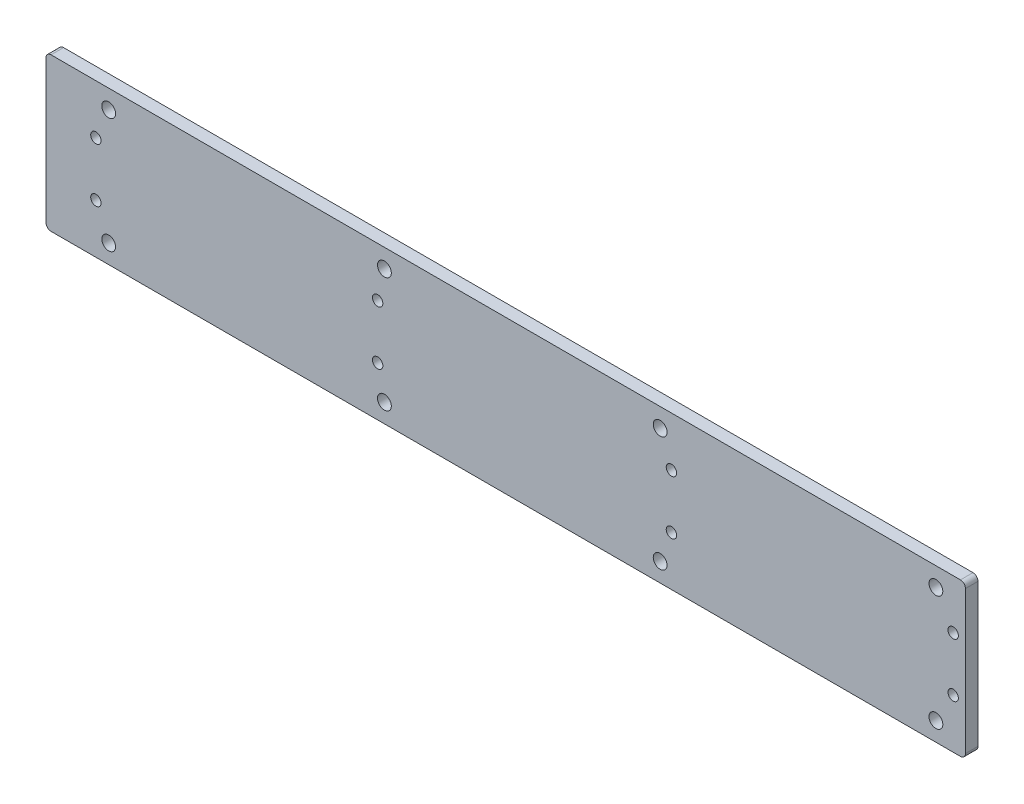
ISO-10303-21;
HEADER;
FILE_DESCRIPTION(('STEP AP214'),'2;1');
FILE_NAME('part.step','',(''),(''),'','','');
FILE_SCHEMA(('AUTOMOTIVE_DESIGN { 1 0 10303 214 1 1 1 1 }'));
ENDSEC;
DATA;
#1=APPLICATION_CONTEXT('core data for automotive mechanical design processes');
#2=APPLICATION_PROTOCOL_DEFINITION('international standard','automotive_design',2000,#1);
#3=PRODUCT_CONTEXT('',#1,'mechanical');
#4=PRODUCT('Part','Part','',(#3));
#5=PRODUCT_RELATED_PRODUCT_CATEGORY('part','',(#4));
#6=PRODUCT_DEFINITION_FORMATION('','',#4);
#7=PRODUCT_DEFINITION_CONTEXT('part definition',#1,'design');
#8=PRODUCT_DEFINITION('design','',#6,#7);
#9=PRODUCT_DEFINITION_SHAPE('','',#8);
#10=(LENGTH_UNIT() NAMED_UNIT(*) SI_UNIT(.MILLI.,.METRE.));
#11=(NAMED_UNIT(*) PLANE_ANGLE_UNIT() SI_UNIT($,.RADIAN.));
#12=(NAMED_UNIT(*) SI_UNIT($,.STERADIAN.) SOLID_ANGLE_UNIT());
#13=UNCERTAINTY_MEASURE_WITH_UNIT(LENGTH_MEASURE(1.E-05),#10,'distance_accuracy_value','');
#14=(GEOMETRIC_REPRESENTATION_CONTEXT(3) GLOBAL_UNCERTAINTY_ASSIGNED_CONTEXT((#13)) GLOBAL_UNIT_ASSIGNED_CONTEXT((#10,
#11,#12)) REPRESENTATION_CONTEXT('',''));
#15=CARTESIAN_POINT('',(0.,0.,0.));
#16=DIRECTION('',(0.,0.,1.));
#17=DIRECTION('',(1.,0.,0.));
#18=AXIS2_PLACEMENT_3D('',#15,#16,#17);
#19=CARTESIAN_POINT('',(-242.443,38.735,6.35));
#20=DIRECTION('',(0.,-1.,0.));
#21=DIRECTION('',(0.,0.,-1.));
#22=AXIS2_PLACEMENT_3D('',#19,#20,#21);
#23=PLANE('',#22);
#24=DIRECTION('',(-1.,0.,0.));
#25=VECTOR('',#24,1.);
#26=CARTESIAN_POINT('',(-242.443,38.735,6.35));
#27=LINE('',#26,#25);
#28=CARTESIAN_POINT('',(220.853,38.735,6.35));
#29=VERTEX_POINT('',#28);
#30=CARTESIAN_POINT('',(-239.903,38.735,6.35));
#31=VERTEX_POINT('',#30);
#32=EDGE_CURVE('E137',#29,#31,#27,.T.);
#33=ORIENTED_EDGE('',*,*,#32,.F.);
#34=DIRECTION('',(0.,0.,-1.));
#35=VECTOR('',#34,1.);
#36=CARTESIAN_POINT('',(220.853,38.735,6.35));
#37=LINE('',#36,#35);
#38=CARTESIAN_POINT('',(220.853,38.735,0.));
#39=VERTEX_POINT('',#38);
#40=EDGE_CURVE('E172',#29,#39,#37,.T.);
#41=ORIENTED_EDGE('',*,*,#40,.T.);
#42=DIRECTION('',(-1.,0.,0.));
#43=VECTOR('',#42,1.);
#44=CARTESIAN_POINT('',(-242.443,38.735,0.));
#45=LINE('',#44,#43);
#46=CARTESIAN_POINT('',(-239.903,38.735,0.));
#47=VERTEX_POINT('',#46);
#48=EDGE_CURVE('E184',#39,#47,#45,.T.);
#49=ORIENTED_EDGE('',*,*,#48,.T.);
#50=DIRECTION('',(0.,0.,-1.));
#51=VECTOR('',#50,1.);
#52=CARTESIAN_POINT('',(-239.903,38.735,6.35));
#53=LINE('',#52,#51);
#54=EDGE_CURVE('E169',#47,#31,#53,.F.);
#55=ORIENTED_EDGE('',*,*,#54,.T.);
#56=EDGE_LOOP('',(#33,#41,#49,#55));
#57=FACE_BOUND('',#56,.T.);
#58=ADVANCED_FACE('F38',(#57),#23,.F.);
#59=CARTESIAN_POINT('',(-242.443,-38.735,6.35));
#60=DIRECTION('',(1.,0.,0.));
#61=DIRECTION('',(0.,0.,-1.));
#62=AXIS2_PLACEMENT_3D('',#59,#60,#61);
#63=PLANE('',#62);
#64=DIRECTION('',(0.,-1.,0.));
#65=VECTOR('',#64,1.);
#66=CARTESIAN_POINT('',(-242.443,-38.735,0.));
#67=LINE('',#66,#65);
#68=CARTESIAN_POINT('',(-242.443,36.195,0.));
#69=VERTEX_POINT('',#68);
#70=CARTESIAN_POINT('',(-242.443,-36.195,0.));
#71=VERTEX_POINT('',#70);
#72=EDGE_CURVE('E139',#69,#71,#67,.T.);
#73=ORIENTED_EDGE('',*,*,#72,.T.);
#74=DIRECTION('',(0.,0.,-1.));
#75=VECTOR('',#74,1.);
#76=CARTESIAN_POINT('',(-242.443,-36.195,6.35));
#77=LINE('',#76,#75);
#78=CARTESIAN_POINT('',(-242.443,-36.195,6.35));
#79=VERTEX_POINT('',#78);
#80=EDGE_CURVE('E11',#71,#79,#77,.F.);
#81=ORIENTED_EDGE('',*,*,#80,.T.);
#82=DIRECTION('',(0.,-1.,0.));
#83=VECTOR('',#82,1.);
#84=CARTESIAN_POINT('',(-242.443,-38.735,6.35));
#85=LINE('',#84,#83);
#86=CARTESIAN_POINT('',(-242.443,36.195,6.35));
#87=VERTEX_POINT('',#86);
#88=EDGE_CURVE('E180',#87,#79,#85,.T.);
#89=ORIENTED_EDGE('',*,*,#88,.F.);
#90=DIRECTION('',(0.,0.,-1.));
#91=VECTOR('',#90,1.);
#92=CARTESIAN_POINT('',(-242.443,36.195,6.35));
#93=LINE('',#92,#91);
#94=EDGE_CURVE('E47',#87,#69,#93,.T.);
#95=ORIENTED_EDGE('',*,*,#94,.T.);
#96=EDGE_LOOP('',(#73,#81,#89,#95));
#97=FACE_BOUND('',#96,.T.);
#98=ADVANCED_FACE('F179',(#97),#63,.F.);
#99=CARTESIAN_POINT('',(-242.443,-38.735,6.35));
#100=DIRECTION('',(0.,1.,0.));
#101=DIRECTION('',(0.,0.,1.));
#102=AXIS2_PLACEMENT_3D('',#99,#100,#101);
#103=PLANE('',#102);
#104=DIRECTION('',(1.,0.,0.));
#105=VECTOR('',#104,1.);
#106=CARTESIAN_POINT('',(-242.443,-38.735,0.));
#107=LINE('',#106,#105);
#108=CARTESIAN_POINT('',(-239.903,-38.735,0.));
#109=VERTEX_POINT('',#108);
#110=CARTESIAN_POINT('',(220.853,-38.735,0.));
#111=VERTEX_POINT('',#110);
#112=EDGE_CURVE('E133',#109,#111,#107,.T.);
#113=ORIENTED_EDGE('',*,*,#112,.T.);
#114=DIRECTION('',(0.,0.,-1.));
#115=VECTOR('',#114,1.);
#116=CARTESIAN_POINT('',(220.853,-38.735,6.35));
#117=LINE('',#116,#115);
#118=CARTESIAN_POINT('',(220.853,-38.735,6.35));
#119=VERTEX_POINT('',#118);
#120=EDGE_CURVE('E109',#111,#119,#117,.F.);
#121=ORIENTED_EDGE('',*,*,#120,.T.);
#122=DIRECTION('',(1.,0.,0.));
#123=VECTOR('',#122,1.);
#124=CARTESIAN_POINT('',(-242.443,-38.735,6.35));
#125=LINE('',#124,#123);
#126=CARTESIAN_POINT('',(-239.903,-38.735,6.35));
#127=VERTEX_POINT('',#126);
#128=EDGE_CURVE('E144',#127,#119,#125,.T.);
#129=ORIENTED_EDGE('',*,*,#128,.F.);
#130=DIRECTION('',(0.,0.,-1.));
#131=VECTOR('',#130,1.);
#132=CARTESIAN_POINT('',(-239.903,-38.735,6.35));
#133=LINE('',#132,#131);
#134=EDGE_CURVE('E115',#127,#109,#133,.T.);
#135=ORIENTED_EDGE('',*,*,#134,.T.);
#136=EDGE_LOOP('',(#113,#121,#129,#135));
#137=FACE_BOUND('',#136,.T.);
#138=ADVANCED_FACE('F364',(#137),#103,.F.);
#139=CARTESIAN_POINT('',(223.393,-19.685,6.35));
#140=DIRECTION('',(-1.,0.,0.));
#141=DIRECTION('',(0.,0.,1.));
#142=AXIS2_PLACEMENT_3D('',#139,#140,#141);
#143=PLANE('',#142);
#144=DIRECTION('',(0.,1.,0.));
#145=VECTOR('',#144,1.);
#146=CARTESIAN_POINT('',(223.393,19.685,6.35));
#147=LINE('',#146,#145);
#148=CARTESIAN_POINT('',(223.393,-36.195,6.35));
#149=VERTEX_POINT('',#148);
#150=CARTESIAN_POINT('',(223.393,36.195,6.35));
#151=VERTEX_POINT('',#150);
#152=EDGE_CURVE('E125',#149,#151,#147,.T.);
#153=ORIENTED_EDGE('',*,*,#152,.F.);
#154=DIRECTION('',(0.,0.,-1.));
#155=VECTOR('',#154,1.);
#156=CARTESIAN_POINT('',(223.393,-36.195,6.35));
#157=LINE('',#156,#155);
#158=CARTESIAN_POINT('',(223.393,-36.195,0.));
#159=VERTEX_POINT('',#158);
#160=EDGE_CURVE('E108',#149,#159,#157,.T.);
#161=ORIENTED_EDGE('',*,*,#160,.T.);
#162=DIRECTION('',(0.,1.,0.));
#163=VECTOR('',#162,1.);
#164=CARTESIAN_POINT('',(223.393,-19.685,0.));
#165=LINE('',#164,#163);
#166=CARTESIAN_POINT('',(223.393,36.195,0.));
#167=VERTEX_POINT('',#166);
#168=EDGE_CURVE('E122',#159,#167,#165,.T.);
#169=ORIENTED_EDGE('',*,*,#168,.T.);
#170=DIRECTION('',(0.,0.,-1.));
#171=VECTOR('',#170,1.);
#172=CARTESIAN_POINT('',(223.393,36.195,6.35));
#173=LINE('',#172,#171);
#174=EDGE_CURVE('E128',#167,#151,#173,.F.);
#175=ORIENTED_EDGE('',*,*,#174,.T.);
#176=EDGE_LOOP('',(#153,#161,#169,#175));
#177=FACE_BOUND('',#176,.T.);
#178=ADVANCED_FACE('F121',(#177),#143,.F.);
#179=CARTESIAN_POINT('',(0.,0.,6.35));
#180=DIRECTION('',(0.,0.,-1.));
#181=DIRECTION('',(-1.,0.,0.));
#182=AXIS2_PLACEMENT_3D('',#179,#180,#181);
#183=PLANE('',#182);
#184=CARTESIAN_POINT('',(-70.9929999999999,29.21,6.35));
#185=DIRECTION('',(0.,0.,1.));
#186=DIRECTION('',(1.,0.,0.));
#187=AXIS2_PLACEMENT_3D('',#184,#185,#186);
#188=CIRCLE('',#187,3.5000057);
#189=CARTESIAN_POINT('',(-67.4929942999999,29.21,6.35));
#190=VERTEX_POINT('',#189);
#191=EDGE_CURVE('E293',#190,#190,#188,.T.);
#192=ORIENTED_EDGE('',*,*,#191,.F.);
#193=EDGE_LOOP('',(#192));
#194=FACE_BOUND('',#193,.T.);
#195=CARTESIAN_POINT('',(68.7070000000001,29.21,6.35));
#196=DIRECTION('',(0.,0.,1.));
#197=DIRECTION('',(1.,0.,0.));
#198=AXIS2_PLACEMENT_3D('',#195,#196,#197);
#199=CIRCLE('',#198,3.5000057);
#200=CARTESIAN_POINT('',(72.2070057000001,29.21,6.35));
#201=VERTEX_POINT('',#200);
#202=EDGE_CURVE('E285',#201,#201,#199,.T.);
#203=ORIENTED_EDGE('',*,*,#202,.F.);
#204=EDGE_LOOP('',(#203));
#205=FACE_BOUND('',#204,.T.);
#206=CARTESIAN_POINT('',(208.407,29.21,6.35));
#207=DIRECTION('',(0.,0.,1.));
#208=DIRECTION('',(1.,0.,0.));
#209=AXIS2_PLACEMENT_3D('',#206,#207,#208);
#210=CIRCLE('',#209,3.5000057);
#211=CARTESIAN_POINT('',(211.9070057,29.21,6.35));
#212=VERTEX_POINT('',#211);
#213=EDGE_CURVE('E277',#212,#212,#210,.T.);
#214=ORIENTED_EDGE('',*,*,#213,.F.);
#215=EDGE_LOOP('',(#214));
#216=FACE_BOUND('',#215,.T.);
#217=CARTESIAN_POINT('',(208.407,-29.21,6.35));
#218=DIRECTION('',(0.,0.,1.));
#219=DIRECTION('',(-1.,0.,0.));
#220=AXIS2_PLACEMENT_3D('',#217,#218,#219);
#221=CIRCLE('',#220,3.5000057);
#222=CARTESIAN_POINT('',(204.9069943,-29.21,6.35));
#223=VERTEX_POINT('',#222);
#224=EDGE_CURVE('E268',#223,#223,#221,.T.);
#225=ORIENTED_EDGE('',*,*,#224,.F.);
#226=EDGE_LOOP('',(#225));
#227=FACE_BOUND('',#226,.T.);
#228=CARTESIAN_POINT('',(68.7070000000001,-29.21,6.35));
#229=DIRECTION('',(0.,0.,1.));
#230=DIRECTION('',(-1.,0.,0.));
#231=AXIS2_PLACEMENT_3D('',#228,#229,#230);
#232=CIRCLE('',#231,3.5000057);
#233=CARTESIAN_POINT('',(65.2069943,-29.21,6.35));
#234=VERTEX_POINT('',#233);
#235=EDGE_CURVE('E316',#234,#234,#232,.T.);
#236=ORIENTED_EDGE('',*,*,#235,.F.);
#237=EDGE_LOOP('',(#236));
#238=FACE_BOUND('',#237,.T.);
#239=CARTESIAN_POINT('',(-70.9929999999999,-29.21,6.35));
#240=DIRECTION('',(0.,0.,1.));
#241=DIRECTION('',(-1.,0.,0.));
#242=AXIS2_PLACEMENT_3D('',#239,#240,#241);
#243=CIRCLE('',#242,3.5000057);
#244=CARTESIAN_POINT('',(-74.4930056999999,-29.21,6.35));
#245=VERTEX_POINT('',#244);
#246=EDGE_CURVE('E308',#245,#245,#243,.T.);
#247=ORIENTED_EDGE('',*,*,#246,.F.);
#248=EDGE_LOOP('',(#247));
#249=FACE_BOUND('',#248,.T.);
#250=CARTESIAN_POINT('',(-210.693,-29.21,6.35));
#251=DIRECTION('',(0.,0.,1.));
#252=DIRECTION('',(-1.,0.,0.));
#253=AXIS2_PLACEMENT_3D('',#250,#251,#252);
#254=CIRCLE('',#253,3.5000057);
#255=CARTESIAN_POINT('',(-214.1930057,-29.21,6.35));
#256=VERTEX_POINT('',#255);
#257=EDGE_CURVE('E300',#256,#256,#254,.T.);
#258=ORIENTED_EDGE('',*,*,#257,.F.);
#259=EDGE_LOOP('',(#258));
#260=FACE_BOUND('',#259,.T.);
#261=CARTESIAN_POINT('',(-210.693,29.21,6.35));
#262=DIRECTION('',(0.,0.,1.));
#263=DIRECTION('',(1.,0.,0.));
#264=AXIS2_PLACEMENT_3D('',#261,#262,#263);
#265=CIRCLE('',#264,3.5000057);
#266=CARTESIAN_POINT('',(-207.1929943,29.21,6.35));
#267=VERTEX_POINT('',#266);
#268=EDGE_CURVE('E260',#267,#267,#265,.T.);
#269=ORIENTED_EDGE('',*,*,#268,.F.);
#270=EDGE_LOOP('',(#269));
#271=FACE_BOUND('',#270,.T.);
#272=CARTESIAN_POINT('',(-217.17,-13.68025,6.35));
#273=DIRECTION('',(0.,0.,1.));
#274=DIRECTION('',(1.,0.,0.));
#275=AXIS2_PLACEMENT_3D('',#272,#273,#274);
#276=CIRCLE('',#275,2.63124999999999);
#277=CARTESIAN_POINT('',(-214.53875,-13.68025,6.35));
#278=VERTEX_POINT('',#277);
#279=EDGE_CURVE('E229',#278,#278,#276,.T.);
#280=ORIENTED_EDGE('',*,*,#279,.F.);
#281=EDGE_LOOP('',(#280));
#282=FACE_BOUND('',#281,.T.);
#283=CARTESIAN_POINT('',(217.17,-13.68025,6.35));
#284=DIRECTION('',(0.,0.,1.));
#285=DIRECTION('',(-1.,0.,0.));
#286=AXIS2_PLACEMENT_3D('',#283,#284,#285);
#287=CIRCLE('',#286,2.63124999999999);
#288=CARTESIAN_POINT('',(214.53875,-13.68025,6.35));
#289=VERTEX_POINT('',#288);
#290=EDGE_CURVE('E221',#289,#289,#287,.T.);
#291=ORIENTED_EDGE('',*,*,#290,.F.);
#292=EDGE_LOOP('',(#291));
#293=FACE_BOUND('',#292,.T.);
#294=CARTESIAN_POINT('',(217.17,13.68025,6.35));
#295=DIRECTION('',(0.,0.,1.));
#296=DIRECTION('',(-1.,0.,0.));
#297=AXIS2_PLACEMENT_3D('',#294,#295,#296);
#298=CIRCLE('',#297,2.63124999999999);
#299=CARTESIAN_POINT('',(214.53875,13.68025,6.35));
#300=VERTEX_POINT('',#299);
#301=EDGE_CURVE('E213',#300,#300,#298,.T.);
#302=ORIENTED_EDGE('',*,*,#301,.F.);
#303=EDGE_LOOP('',(#302));
#304=FACE_BOUND('',#303,.T.);
#305=CARTESIAN_POINT('',(-74.4219999999999,13.68025,6.35));
#306=DIRECTION('',(0.,0.,1.));
#307=DIRECTION('',(1.,0.,0.));
#308=AXIS2_PLACEMENT_3D('',#305,#306,#307);
#309=CIRCLE('',#308,2.63125);
#310=CARTESIAN_POINT('',(-71.7907499999999,13.68025,6.35));
#311=VERTEX_POINT('',#310);
#312=EDGE_CURVE('E204',#311,#311,#309,.T.);
#313=ORIENTED_EDGE('',*,*,#312,.F.);
#314=EDGE_LOOP('',(#313));
#315=FACE_BOUND('',#314,.T.);
#316=CARTESIAN_POINT('',(74.422,-13.68025,6.35));
#317=DIRECTION('',(0.,0.,1.));
#318=DIRECTION('',(-1.,0.,0.));
#319=AXIS2_PLACEMENT_3D('',#316,#317,#318);
#320=CIRCLE('',#319,2.63125);
#321=CARTESIAN_POINT('',(71.79075,-13.68025,6.35));
#322=VERTEX_POINT('',#321);
#323=EDGE_CURVE('E252',#322,#322,#320,.T.);
#324=ORIENTED_EDGE('',*,*,#323,.F.);
#325=EDGE_LOOP('',(#324));
#326=FACE_BOUND('',#325,.T.);
#327=CARTESIAN_POINT('',(74.422,13.68025,6.35));
#328=DIRECTION('',(0.,0.,1.));
#329=DIRECTION('',(1.,0.,0.));
#330=AXIS2_PLACEMENT_3D('',#327,#328,#329);
#331=CIRCLE('',#330,2.63125);
#332=CARTESIAN_POINT('',(77.05325,13.68025,6.35));
#333=VERTEX_POINT('',#332);
#334=EDGE_CURVE('E236',#333,#333,#331,.T.);
#335=ORIENTED_EDGE('',*,*,#334,.F.);
#336=EDGE_LOOP('',(#335));
#337=FACE_BOUND('',#336,.T.);
#338=CARTESIAN_POINT('',(-74.4219999999999,-13.68025,6.35));
#339=DIRECTION('',(0.,0.,1.));
#340=DIRECTION('',(-1.,0.,0.));
#341=AXIS2_PLACEMENT_3D('',#338,#339,#340);
#342=CIRCLE('',#341,2.63125);
#343=CARTESIAN_POINT('',(-77.0532499999999,-13.68025,6.35));
#344=VERTEX_POINT('',#343);
#345=EDGE_CURVE('E245',#344,#344,#342,.T.);
#346=ORIENTED_EDGE('',*,*,#345,.F.);
#347=EDGE_LOOP('',(#346));
#348=FACE_BOUND('',#347,.T.);
#349=CARTESIAN_POINT('',(-217.17,13.68025,6.35));
#350=DIRECTION('',(0.,0.,1.));
#351=DIRECTION('',(1.,0.,0.));
#352=AXIS2_PLACEMENT_3D('',#349,#350,#351);
#353=CIRCLE('',#352,2.63124999999999);
#354=CARTESIAN_POINT('',(-214.53875,13.68025,6.35));
#355=VERTEX_POINT('',#354);
#356=EDGE_CURVE('E196',#355,#355,#353,.T.);
#357=ORIENTED_EDGE('',*,*,#356,.F.);
#358=EDGE_LOOP('',(#357));
#359=FACE_BOUND('',#358,.T.);
#360=ORIENTED_EDGE('',*,*,#128,.T.);
#361=CARTESIAN_POINT('',(220.853,-36.195,6.35));
#362=DIRECTION('',(0.,0.,-1.));
#363=DIRECTION('',(-1.,0.,0.));
#364=AXIS2_PLACEMENT_3D('',#361,#362,#363);
#365=CIRCLE('',#364,2.54);
#366=EDGE_CURVE('E166',#119,#149,#365,.F.);
#367=ORIENTED_EDGE('',*,*,#366,.T.);
#368=ORIENTED_EDGE('',*,*,#152,.T.);
#369=CARTESIAN_POINT('',(220.853,36.195,6.35));
#370=DIRECTION('',(0.,0.,-1.));
#371=DIRECTION('',(-1.,0.,0.));
#372=AXIS2_PLACEMENT_3D('',#369,#370,#371);
#373=CIRCLE('',#372,2.54);
#374=EDGE_CURVE('E163',#151,#29,#373,.F.);
#375=ORIENTED_EDGE('',*,*,#374,.T.);
#376=ORIENTED_EDGE('',*,*,#32,.T.);
#377=CARTESIAN_POINT('',(-239.903,36.195,6.35));
#378=DIRECTION('',(0.,0.,-1.));
#379=DIRECTION('',(-1.,0.,0.));
#380=AXIS2_PLACEMENT_3D('',#377,#378,#379);
#381=CIRCLE('',#380,2.54);
#382=EDGE_CURVE('E59',#31,#87,#381,.F.);
#383=ORIENTED_EDGE('',*,*,#382,.T.);
#384=ORIENTED_EDGE('',*,*,#88,.T.);
#385=CARTESIAN_POINT('',(-239.903,-36.195,6.35));
#386=DIRECTION('',(0.,0.,-1.));
#387=DIRECTION('',(-1.,0.,0.));
#388=AXIS2_PLACEMENT_3D('',#385,#386,#387);
#389=CIRCLE('',#388,2.54);
#390=EDGE_CURVE('E160',#79,#127,#389,.F.);
#391=ORIENTED_EDGE('',*,*,#390,.T.);
#392=EDGE_LOOP('',(#360,#367,#368,#375,#376,#383,#384,#391));
#393=FACE_BOUND('',#392,.T.);
#394=ADVANCED_FACE('F334',(#194,#205,#216,#227,#238,#249,#260,#271,#282,#293,#304,#315,#326,
#337,#348,#359,#393),#183,.F.);
#395=CARTESIAN_POINT('',(0.,0.,0.));
#396=DIRECTION('',(0.,0.,-1.));
#397=DIRECTION('',(-1.,0.,0.));
#398=AXIS2_PLACEMENT_3D('',#395,#396,#397);
#399=PLANE('',#398);
#400=CARTESIAN_POINT('',(-70.9929999999999,29.21,0.));
#401=DIRECTION('',(0.,0.,1.));
#402=DIRECTION('',(1.,0.,0.));
#403=AXIS2_PLACEMENT_3D('',#400,#401,#402);
#404=CIRCLE('',#403,3.5000057);
#405=CARTESIAN_POINT('',(-67.4929942999999,29.21,0.));
#406=VERTEX_POINT('',#405);
#407=EDGE_CURVE('E264',#406,#406,#404,.T.);
#408=ORIENTED_EDGE('',*,*,#407,.T.);
#409=EDGE_LOOP('',(#408));
#410=FACE_BOUND('',#409,.T.);
#411=CARTESIAN_POINT('',(68.7070000000001,29.21,0.));
#412=DIRECTION('',(0.,0.,1.));
#413=DIRECTION('',(1.,0.,0.));
#414=AXIS2_PLACEMENT_3D('',#411,#412,#413);
#415=CIRCLE('',#414,3.5000057);
#416=CARTESIAN_POINT('',(72.2070057000001,29.21,0.));
#417=VERTEX_POINT('',#416);
#418=EDGE_CURVE('E289',#417,#417,#415,.T.);
#419=ORIENTED_EDGE('',*,*,#418,.T.);
#420=EDGE_LOOP('',(#419));
#421=FACE_BOUND('',#420,.T.);
#422=CARTESIAN_POINT('',(208.407,29.21,0.));
#423=DIRECTION('',(0.,0.,1.));
#424=DIRECTION('',(1.,0.,0.));
#425=AXIS2_PLACEMENT_3D('',#422,#423,#424);
#426=CIRCLE('',#425,3.5000057);
#427=CARTESIAN_POINT('',(211.9070057,29.21,0.));
#428=VERTEX_POINT('',#427);
#429=EDGE_CURVE('E281',#428,#428,#426,.T.);
#430=ORIENTED_EDGE('',*,*,#429,.T.);
#431=EDGE_LOOP('',(#430));
#432=FACE_BOUND('',#431,.T.);
#433=CARTESIAN_POINT('',(208.407,-29.21,0.));
#434=DIRECTION('',(0.,0.,1.));
#435=DIRECTION('',(-1.,0.,0.));
#436=AXIS2_PLACEMENT_3D('',#433,#434,#435);
#437=CIRCLE('',#436,3.5000057);
#438=CARTESIAN_POINT('',(204.9069943,-29.21,0.));
#439=VERTEX_POINT('',#438);
#440=EDGE_CURVE('E272',#439,#439,#437,.T.);
#441=ORIENTED_EDGE('',*,*,#440,.T.);
#442=EDGE_LOOP('',(#441));
#443=FACE_BOUND('',#442,.T.);
#444=CARTESIAN_POINT('',(68.7070000000001,-29.21,0.));
#445=DIRECTION('',(0.,0.,1.));
#446=DIRECTION('',(-1.,0.,0.));
#447=AXIS2_PLACEMENT_3D('',#444,#445,#446);
#448=CIRCLE('',#447,3.5000057);
#449=CARTESIAN_POINT('',(65.2069943,-29.21,0.));
#450=VERTEX_POINT('',#449);
#451=EDGE_CURVE('E273',#450,#450,#448,.T.);
#452=ORIENTED_EDGE('',*,*,#451,.T.);
#453=EDGE_LOOP('',(#452));
#454=FACE_BOUND('',#453,.T.);
#455=CARTESIAN_POINT('',(-70.9929999999999,-29.21,0.));
#456=DIRECTION('',(0.,0.,1.));
#457=DIRECTION('',(-1.,0.,0.));
#458=AXIS2_PLACEMENT_3D('',#455,#456,#457);
#459=CIRCLE('',#458,3.5000057);
#460=CARTESIAN_POINT('',(-74.4930056999999,-29.21,0.));
#461=VERTEX_POINT('',#460);
#462=EDGE_CURVE('E312',#461,#461,#459,.T.);
#463=ORIENTED_EDGE('',*,*,#462,.T.);
#464=EDGE_LOOP('',(#463));
#465=FACE_BOUND('',#464,.T.);
#466=CARTESIAN_POINT('',(-210.693,-29.21,0.));
#467=DIRECTION('',(0.,0.,1.));
#468=DIRECTION('',(-1.,0.,0.));
#469=AXIS2_PLACEMENT_3D('',#466,#467,#468);
#470=CIRCLE('',#469,3.5000057);
#471=CARTESIAN_POINT('',(-214.1930057,-29.21,0.));
#472=VERTEX_POINT('',#471);
#473=EDGE_CURVE('E304',#472,#472,#470,.T.);
#474=ORIENTED_EDGE('',*,*,#473,.T.);
#475=EDGE_LOOP('',(#474));
#476=FACE_BOUND('',#475,.T.);
#477=CARTESIAN_POINT('',(-210.693,29.21,0.));
#478=DIRECTION('',(0.,0.,1.));
#479=DIRECTION('',(1.,0.,0.));
#480=AXIS2_PLACEMENT_3D('',#477,#478,#479);
#481=CIRCLE('',#480,3.5000057);
#482=CARTESIAN_POINT('',(-207.1929943,29.21,0.));
#483=VERTEX_POINT('',#482);
#484=EDGE_CURVE('E256',#483,#483,#481,.T.);
#485=ORIENTED_EDGE('',*,*,#484,.T.);
#486=EDGE_LOOP('',(#485));
#487=FACE_BOUND('',#486,.T.);
#488=CARTESIAN_POINT('',(-217.17,-13.68025,0.));
#489=DIRECTION('',(0.,0.,1.));
#490=DIRECTION('',(1.,0.,0.));
#491=AXIS2_PLACEMENT_3D('',#488,#489,#490);
#492=CIRCLE('',#491,2.63124999999999);
#493=CARTESIAN_POINT('',(-214.53875,-13.68025,0.));
#494=VERTEX_POINT('',#493);
#495=EDGE_CURVE('E200',#494,#494,#492,.T.);
#496=ORIENTED_EDGE('',*,*,#495,.T.);
#497=EDGE_LOOP('',(#496));
#498=FACE_BOUND('',#497,.T.);
#499=CARTESIAN_POINT('',(217.17,-13.68025,0.));
#500=DIRECTION('',(0.,0.,1.));
#501=DIRECTION('',(-1.,0.,0.));
#502=AXIS2_PLACEMENT_3D('',#499,#500,#501);
#503=CIRCLE('',#502,2.63124999999999);
#504=CARTESIAN_POINT('',(214.53875,-13.68025,0.));
#505=VERTEX_POINT('',#504);
#506=EDGE_CURVE('E225',#505,#505,#503,.T.);
#507=ORIENTED_EDGE('',*,*,#506,.T.);
#508=EDGE_LOOP('',(#507));
#509=FACE_BOUND('',#508,.T.);
#510=CARTESIAN_POINT('',(217.17,13.68025,0.));
#511=DIRECTION('',(0.,0.,1.));
#512=DIRECTION('',(-1.,0.,0.));
#513=AXIS2_PLACEMENT_3D('',#510,#511,#512);
#514=CIRCLE('',#513,2.63124999999999);
#515=CARTESIAN_POINT('',(214.53875,13.68025,0.));
#516=VERTEX_POINT('',#515);
#517=EDGE_CURVE('E217',#516,#516,#514,.T.);
#518=ORIENTED_EDGE('',*,*,#517,.T.);
#519=EDGE_LOOP('',(#518));
#520=FACE_BOUND('',#519,.T.);
#521=CARTESIAN_POINT('',(-74.4219999999999,13.68025,0.));
#522=DIRECTION('',(0.,0.,1.));
#523=DIRECTION('',(1.,0.,0.));
#524=AXIS2_PLACEMENT_3D('',#521,#522,#523);
#525=CIRCLE('',#524,2.63125);
#526=CARTESIAN_POINT('',(-71.7907499999999,13.68025,0.));
#527=VERTEX_POINT('',#526);
#528=EDGE_CURVE('E208',#527,#527,#525,.T.);
#529=ORIENTED_EDGE('',*,*,#528,.T.);
#530=EDGE_LOOP('',(#529));
#531=FACE_BOUND('',#530,.T.);
#532=CARTESIAN_POINT('',(74.422,-13.68025,0.));
#533=DIRECTION('',(0.,0.,1.));
#534=DIRECTION('',(-1.,0.,0.));
#535=AXIS2_PLACEMENT_3D('',#532,#533,#534);
#536=CIRCLE('',#535,2.63125);
#537=CARTESIAN_POINT('',(71.79075,-13.68025,0.));
#538=VERTEX_POINT('',#537);
#539=EDGE_CURVE('E241',#538,#538,#536,.T.);
#540=ORIENTED_EDGE('',*,*,#539,.T.);
#541=EDGE_LOOP('',(#540));
#542=FACE_BOUND('',#541,.T.);
#543=CARTESIAN_POINT('',(74.422,13.68025,0.));
#544=DIRECTION('',(0.,0.,1.));
#545=DIRECTION('',(1.,0.,0.));
#546=AXIS2_PLACEMENT_3D('',#543,#544,#545);
#547=CIRCLE('',#546,2.63125);
#548=CARTESIAN_POINT('',(77.05325,13.68025,0.));
#549=VERTEX_POINT('',#548);
#550=EDGE_CURVE('E240',#549,#549,#547,.T.);
#551=ORIENTED_EDGE('',*,*,#550,.T.);
#552=EDGE_LOOP('',(#551));
#553=FACE_BOUND('',#552,.T.);
#554=CARTESIAN_POINT('',(-74.4219999999999,-13.68025,0.));
#555=DIRECTION('',(0.,0.,1.));
#556=DIRECTION('',(-1.,0.,0.));
#557=AXIS2_PLACEMENT_3D('',#554,#555,#556);
#558=CIRCLE('',#557,2.63125);
#559=CARTESIAN_POINT('',(-77.0532499999999,-13.68025,0.));
#560=VERTEX_POINT('',#559);
#561=EDGE_CURVE('E209',#560,#560,#558,.T.);
#562=ORIENTED_EDGE('',*,*,#561,.T.);
#563=EDGE_LOOP('',(#562));
#564=FACE_BOUND('',#563,.T.);
#565=CARTESIAN_POINT('',(-217.17,13.68025,0.));
#566=DIRECTION('',(0.,0.,1.));
#567=DIRECTION('',(1.,0.,0.));
#568=AXIS2_PLACEMENT_3D('',#565,#566,#567);
#569=CIRCLE('',#568,2.63124999999999);
#570=CARTESIAN_POINT('',(-214.53875,13.68025,0.));
#571=VERTEX_POINT('',#570);
#572=EDGE_CURVE('E186',#571,#571,#569,.T.);
#573=ORIENTED_EDGE('',*,*,#572,.T.);
#574=EDGE_LOOP('',(#573));
#575=FACE_BOUND('',#574,.T.);
#576=ORIENTED_EDGE('',*,*,#168,.F.);
#577=CARTESIAN_POINT('',(220.853,-36.195,0.));
#578=DIRECTION('',(0.,0.,-1.));
#579=DIRECTION('',(-1.,0.,0.));
#580=AXIS2_PLACEMENT_3D('',#577,#578,#579);
#581=CIRCLE('',#580,2.54);
#582=EDGE_CURVE('E104',#159,#111,#581,.T.);
#583=ORIENTED_EDGE('',*,*,#582,.T.);
#584=ORIENTED_EDGE('',*,*,#112,.F.);
#585=CARTESIAN_POINT('',(-239.903,-36.195,0.));
#586=DIRECTION('',(0.,0.,-1.));
#587=DIRECTION('',(-1.,0.,0.));
#588=AXIS2_PLACEMENT_3D('',#585,#586,#587);
#589=CIRCLE('',#588,2.54);
#590=EDGE_CURVE('E148',#109,#71,#589,.T.);
#591=ORIENTED_EDGE('',*,*,#590,.T.);
#592=ORIENTED_EDGE('',*,*,#72,.F.);
#593=CARTESIAN_POINT('',(-239.903,36.195,0.));
#594=DIRECTION('',(0.,0.,-1.));
#595=DIRECTION('',(-1.,0.,0.));
#596=AXIS2_PLACEMENT_3D('',#593,#594,#595);
#597=CIRCLE('',#596,2.54);
#598=EDGE_CURVE('E127',#69,#47,#597,.T.);
#599=ORIENTED_EDGE('',*,*,#598,.T.);
#600=ORIENTED_EDGE('',*,*,#48,.F.);
#601=CARTESIAN_POINT('',(220.853,36.195,0.));
#602=DIRECTION('',(0.,0.,-1.));
#603=DIRECTION('',(-1.,0.,0.));
#604=AXIS2_PLACEMENT_3D('',#601,#602,#603);
#605=CIRCLE('',#604,2.54);
#606=EDGE_CURVE('E116',#39,#167,#605,.T.);
#607=ORIENTED_EDGE('',*,*,#606,.T.);
#608=EDGE_LOOP('',(#576,#583,#584,#591,#592,#599,#600,#607));
#609=FACE_BOUND('',#608,.T.);
#610=ADVANCED_FACE('F130',(#410,#421,#432,#443,#454,#465,#476,#487,#498,#509,#520,#531,#542,
#553,#564,#575,#609),#399,.T.);
#611=CARTESIAN_POINT('',(-217.17,13.68025,0.));
#612=DIRECTION('',(0.,0.,1.));
#613=DIRECTION('',(1.,0.,0.));
#614=AXIS2_PLACEMENT_3D('',#611,#612,#613);
#615=CYLINDRICAL_SURFACE('',#614,2.63124999999999);
#616=ORIENTED_EDGE('',*,*,#572,.F.);
#617=EDGE_LOOP('',(#616));
#618=FACE_BOUND('',#617,.T.);
#619=ORIENTED_EDGE('',*,*,#356,.T.);
#620=EDGE_LOOP('',(#619));
#621=FACE_BOUND('',#620,.T.);
#622=ADVANCED_FACE('F425',(#618,#621),#615,.F.);
#623=CARTESIAN_POINT('',(-74.4219999999999,-13.68025,0.));
#624=DIRECTION('',(0.,0.,1.));
#625=DIRECTION('',(1.,0.,0.));
#626=AXIS2_PLACEMENT_3D('',#623,#624,#625);
#627=CYLINDRICAL_SURFACE('',#626,2.63125);
#628=ORIENTED_EDGE('',*,*,#561,.F.);
#629=EDGE_LOOP('',(#628));
#630=FACE_BOUND('',#629,.T.);
#631=ORIENTED_EDGE('',*,*,#345,.T.);
#632=EDGE_LOOP('',(#631));
#633=FACE_BOUND('',#632,.T.);
#634=ADVANCED_FACE('F422',(#630,#633),#627,.F.);
#635=CARTESIAN_POINT('',(74.422,13.68025,0.));
#636=DIRECTION('',(0.,0.,1.));
#637=DIRECTION('',(1.,0.,0.));
#638=AXIS2_PLACEMENT_3D('',#635,#636,#637);
#639=CYLINDRICAL_SURFACE('',#638,2.63125);
#640=ORIENTED_EDGE('',*,*,#550,.F.);
#641=EDGE_LOOP('',(#640));
#642=FACE_BOUND('',#641,.T.);
#643=ORIENTED_EDGE('',*,*,#334,.T.);
#644=EDGE_LOOP('',(#643));
#645=FACE_BOUND('',#644,.T.);
#646=ADVANCED_FACE('F420',(#642,#645),#639,.F.);
#647=CARTESIAN_POINT('',(74.422,-13.68025,0.));
#648=DIRECTION('',(0.,0.,1.));
#649=DIRECTION('',(1.,0.,0.));
#650=AXIS2_PLACEMENT_3D('',#647,#648,#649);
#651=CYLINDRICAL_SURFACE('',#650,2.63125);
#652=ORIENTED_EDGE('',*,*,#539,.F.);
#653=EDGE_LOOP('',(#652));
#654=FACE_BOUND('',#653,.T.);
#655=ORIENTED_EDGE('',*,*,#323,.T.);
#656=EDGE_LOOP('',(#655));
#657=FACE_BOUND('',#656,.T.);
#658=ADVANCED_FACE('F416',(#654,#657),#651,.F.);
#659=CARTESIAN_POINT('',(-74.4219999999999,13.68025,0.));
#660=DIRECTION('',(0.,0.,1.));
#661=DIRECTION('',(1.,0.,0.));
#662=AXIS2_PLACEMENT_3D('',#659,#660,#661);
#663=CYLINDRICAL_SURFACE('',#662,2.63125);
#664=ORIENTED_EDGE('',*,*,#528,.F.);
#665=EDGE_LOOP('',(#664));
#666=FACE_BOUND('',#665,.T.);
#667=ORIENTED_EDGE('',*,*,#312,.T.);
#668=EDGE_LOOP('',(#667));
#669=FACE_BOUND('',#668,.T.);
#670=ADVANCED_FACE('F419',(#666,#669),#663,.F.);
#671=CARTESIAN_POINT('',(217.17,13.68025,0.));
#672=DIRECTION('',(0.,0.,1.));
#673=DIRECTION('',(1.,0.,0.));
#674=AXIS2_PLACEMENT_3D('',#671,#672,#673);
#675=CYLINDRICAL_SURFACE('',#674,2.63124999999999);
#676=ORIENTED_EDGE('',*,*,#517,.F.);
#677=EDGE_LOOP('',(#676));
#678=FACE_BOUND('',#677,.T.);
#679=ORIENTED_EDGE('',*,*,#301,.T.);
#680=EDGE_LOOP('',(#679));
#681=FACE_BOUND('',#680,.T.);
#682=ADVANCED_FACE('F436',(#678,#681),#675,.F.);
#683=CARTESIAN_POINT('',(217.17,-13.68025,0.));
#684=DIRECTION('',(0.,0.,1.));
#685=DIRECTION('',(1.,0.,0.));
#686=AXIS2_PLACEMENT_3D('',#683,#684,#685);
#687=CYLINDRICAL_SURFACE('',#686,2.63124999999999);
#688=ORIENTED_EDGE('',*,*,#506,.F.);
#689=EDGE_LOOP('',(#688));
#690=FACE_BOUND('',#689,.T.);
#691=ORIENTED_EDGE('',*,*,#290,.T.);
#692=EDGE_LOOP('',(#691));
#693=FACE_BOUND('',#692,.T.);
#694=ADVANCED_FACE('F432',(#690,#693),#687,.F.);
#695=CARTESIAN_POINT('',(-217.17,-13.68025,0.));
#696=DIRECTION('',(0.,0.,1.));
#697=DIRECTION('',(1.,0.,0.));
#698=AXIS2_PLACEMENT_3D('',#695,#696,#697);
#699=CYLINDRICAL_SURFACE('',#698,2.63124999999999);
#700=ORIENTED_EDGE('',*,*,#495,.F.);
#701=EDGE_LOOP('',(#700));
#702=FACE_BOUND('',#701,.T.);
#703=ORIENTED_EDGE('',*,*,#279,.T.);
#704=EDGE_LOOP('',(#703));
#705=FACE_BOUND('',#704,.T.);
#706=ADVANCED_FACE('F414',(#702,#705),#699,.F.);
#707=CARTESIAN_POINT('',(-210.693,29.21,0.));
#708=DIRECTION('',(0.,0.,1.));
#709=DIRECTION('',(1.,0.,0.));
#710=AXIS2_PLACEMENT_3D('',#707,#708,#709);
#711=CYLINDRICAL_SURFACE('',#710,3.5000057);
#712=ORIENTED_EDGE('',*,*,#484,.F.);
#713=EDGE_LOOP('',(#712));
#714=FACE_BOUND('',#713,.T.);
#715=ORIENTED_EDGE('',*,*,#268,.T.);
#716=EDGE_LOOP('',(#715));
#717=FACE_BOUND('',#716,.T.);
#718=ADVANCED_FACE('F411',(#714,#717),#711,.F.);
#719=CARTESIAN_POINT('',(-210.693,-29.21,0.));
#720=DIRECTION('',(0.,0.,1.));
#721=DIRECTION('',(1.,0.,0.));
#722=AXIS2_PLACEMENT_3D('',#719,#720,#721);
#723=CYLINDRICAL_SURFACE('',#722,3.5000057);
#724=ORIENTED_EDGE('',*,*,#473,.F.);
#725=EDGE_LOOP('',(#724));
#726=FACE_BOUND('',#725,.T.);
#727=ORIENTED_EDGE('',*,*,#257,.T.);
#728=EDGE_LOOP('',(#727));
#729=FACE_BOUND('',#728,.T.);
#730=ADVANCED_FACE('F402',(#726,#729),#723,.F.);
#731=CARTESIAN_POINT('',(-70.9929999999999,-29.21,0.));
#732=DIRECTION('',(0.,0.,1.));
#733=DIRECTION('',(1.,0.,0.));
#734=AXIS2_PLACEMENT_3D('',#731,#732,#733);
#735=CYLINDRICAL_SURFACE('',#734,3.5000057);
#736=ORIENTED_EDGE('',*,*,#462,.F.);
#737=EDGE_LOOP('',(#736));
#738=FACE_BOUND('',#737,.T.);
#739=ORIENTED_EDGE('',*,*,#246,.T.);
#740=EDGE_LOOP('',(#739));
#741=FACE_BOUND('',#740,.T.);
#742=ADVANCED_FACE('F330',(#738,#741),#735,.F.);
#743=CARTESIAN_POINT('',(68.7070000000001,-29.21,0.));
#744=DIRECTION('',(0.,0.,1.));
#745=DIRECTION('',(1.,0.,0.));
#746=AXIS2_PLACEMENT_3D('',#743,#744,#745);
#747=CYLINDRICAL_SURFACE('',#746,3.5000057);
#748=ORIENTED_EDGE('',*,*,#451,.F.);
#749=EDGE_LOOP('',(#748));
#750=FACE_BOUND('',#749,.T.);
#751=ORIENTED_EDGE('',*,*,#235,.T.);
#752=EDGE_LOOP('',(#751));
#753=FACE_BOUND('',#752,.T.);
#754=ADVANCED_FACE('F326',(#750,#753),#747,.F.);
#755=CARTESIAN_POINT('',(208.407,-29.21,0.));
#756=DIRECTION('',(0.,0.,1.));
#757=DIRECTION('',(1.,0.,0.));
#758=AXIS2_PLACEMENT_3D('',#755,#756,#757);
#759=CYLINDRICAL_SURFACE('',#758,3.5000057);
#760=ORIENTED_EDGE('',*,*,#440,.F.);
#761=EDGE_LOOP('',(#760));
#762=FACE_BOUND('',#761,.T.);
#763=ORIENTED_EDGE('',*,*,#224,.T.);
#764=EDGE_LOOP('',(#763));
#765=FACE_BOUND('',#764,.T.);
#766=ADVANCED_FACE('F329',(#762,#765),#759,.F.);
#767=CARTESIAN_POINT('',(208.407,29.21,0.));
#768=DIRECTION('',(0.,0.,1.));
#769=DIRECTION('',(1.,0.,0.));
#770=AXIS2_PLACEMENT_3D('',#767,#768,#769);
#771=CYLINDRICAL_SURFACE('',#770,3.5000057);
#772=ORIENTED_EDGE('',*,*,#429,.F.);
#773=EDGE_LOOP('',(#772));
#774=FACE_BOUND('',#773,.T.);
#775=ORIENTED_EDGE('',*,*,#213,.T.);
#776=EDGE_LOOP('',(#775));
#777=FACE_BOUND('',#776,.T.);
#778=ADVANCED_FACE('F396',(#774,#777),#771,.F.);
#779=CARTESIAN_POINT('',(68.7070000000001,29.21,0.));
#780=DIRECTION('',(0.,0.,1.));
#781=DIRECTION('',(1.,0.,0.));
#782=AXIS2_PLACEMENT_3D('',#779,#780,#781);
#783=CYLINDRICAL_SURFACE('',#782,3.5000057);
#784=ORIENTED_EDGE('',*,*,#418,.F.);
#785=EDGE_LOOP('',(#784));
#786=FACE_BOUND('',#785,.T.);
#787=ORIENTED_EDGE('',*,*,#202,.T.);
#788=EDGE_LOOP('',(#787));
#789=FACE_BOUND('',#788,.T.);
#790=ADVANCED_FACE('F390',(#786,#789),#783,.F.);
#791=CARTESIAN_POINT('',(-70.9929999999999,29.21,0.));
#792=DIRECTION('',(0.,0.,1.));
#793=DIRECTION('',(1.,0.,0.));
#794=AXIS2_PLACEMENT_3D('',#791,#792,#793);
#795=CYLINDRICAL_SURFACE('',#794,3.5000057);
#796=ORIENTED_EDGE('',*,*,#407,.F.);
#797=EDGE_LOOP('',(#796));
#798=FACE_BOUND('',#797,.T.);
#799=ORIENTED_EDGE('',*,*,#191,.T.);
#800=EDGE_LOOP('',(#799));
#801=FACE_BOUND('',#800,.T.);
#802=ADVANCED_FACE('F386',(#798,#801),#795,.F.);
#803=CARTESIAN_POINT('',(220.853,-36.195,6.35));
#804=DIRECTION('',(0.,0.,-1.));
#805=DIRECTION('',(-1.,0.,0.));
#806=AXIS2_PLACEMENT_3D('',#803,#804,#805);
#807=CYLINDRICAL_SURFACE('',#806,2.54);
#808=ORIENTED_EDGE('',*,*,#366,.F.);
#809=ORIENTED_EDGE('',*,*,#120,.F.);
#810=ORIENTED_EDGE('',*,*,#582,.F.);
#811=ORIENTED_EDGE('',*,*,#160,.F.);
#812=EDGE_LOOP('',(#808,#809,#810,#811));
#813=FACE_BOUND('',#812,.T.);
#814=ADVANCED_FACE('F107',(#813),#807,.T.);
#815=CARTESIAN_POINT('',(220.853,36.195,6.35));
#816=DIRECTION('',(0.,0.,-1.));
#817=DIRECTION('',(-1.,0.,0.));
#818=AXIS2_PLACEMENT_3D('',#815,#816,#817);
#819=CYLINDRICAL_SURFACE('',#818,2.54);
#820=ORIENTED_EDGE('',*,*,#374,.F.);
#821=ORIENTED_EDGE('',*,*,#174,.F.);
#822=ORIENTED_EDGE('',*,*,#606,.F.);
#823=ORIENTED_EDGE('',*,*,#40,.F.);
#824=EDGE_LOOP('',(#820,#821,#822,#823));
#825=FACE_BOUND('',#824,.T.);
#826=ADVANCED_FACE('F368',(#825),#819,.T.);
#827=CARTESIAN_POINT('',(-239.903,-36.195,6.35));
#828=DIRECTION('',(0.,0.,-1.));
#829=DIRECTION('',(-1.,0.,0.));
#830=AXIS2_PLACEMENT_3D('',#827,#828,#829);
#831=CYLINDRICAL_SURFACE('',#830,2.54);
#832=ORIENTED_EDGE('',*,*,#390,.F.);
#833=ORIENTED_EDGE('',*,*,#80,.F.);
#834=ORIENTED_EDGE('',*,*,#590,.F.);
#835=ORIENTED_EDGE('',*,*,#134,.F.);
#836=EDGE_LOOP('',(#832,#833,#834,#835));
#837=FACE_BOUND('',#836,.T.);
#838=ADVANCED_FACE('F366',(#837),#831,.T.);
#839=CARTESIAN_POINT('',(-239.903,36.195,6.35));
#840=DIRECTION('',(0.,0.,-1.));
#841=DIRECTION('',(-1.,0.,0.));
#842=AXIS2_PLACEMENT_3D('',#839,#840,#841);
#843=CYLINDRICAL_SURFACE('',#842,2.54);
#844=ORIENTED_EDGE('',*,*,#382,.F.);
#845=ORIENTED_EDGE('',*,*,#54,.F.);
#846=ORIENTED_EDGE('',*,*,#598,.F.);
#847=ORIENTED_EDGE('',*,*,#94,.F.);
#848=EDGE_LOOP('',(#844,#845,#846,#847));
#849=FACE_BOUND('',#848,.T.);
#850=ADVANCED_FACE('F40',(#849),#843,.T.);
#851=CLOSED_SHELL('',(#58,#98,#138,#178,#394,#610,#622,#634,#646,#658,#670,#682,#694,#706,#718,
#730,#742,#754,#766,#778,#790,#802,#814,#826,#838,#850));
#852=MANIFOLD_SOLID_BREP('B2',#851);
#853=ADVANCED_BREP_SHAPE_REPRESENTATION('',(#18,#852),#14);
#854=SHAPE_DEFINITION_REPRESENTATION(#9,#853);
ENDSEC;
END-ISO-10303-21;
